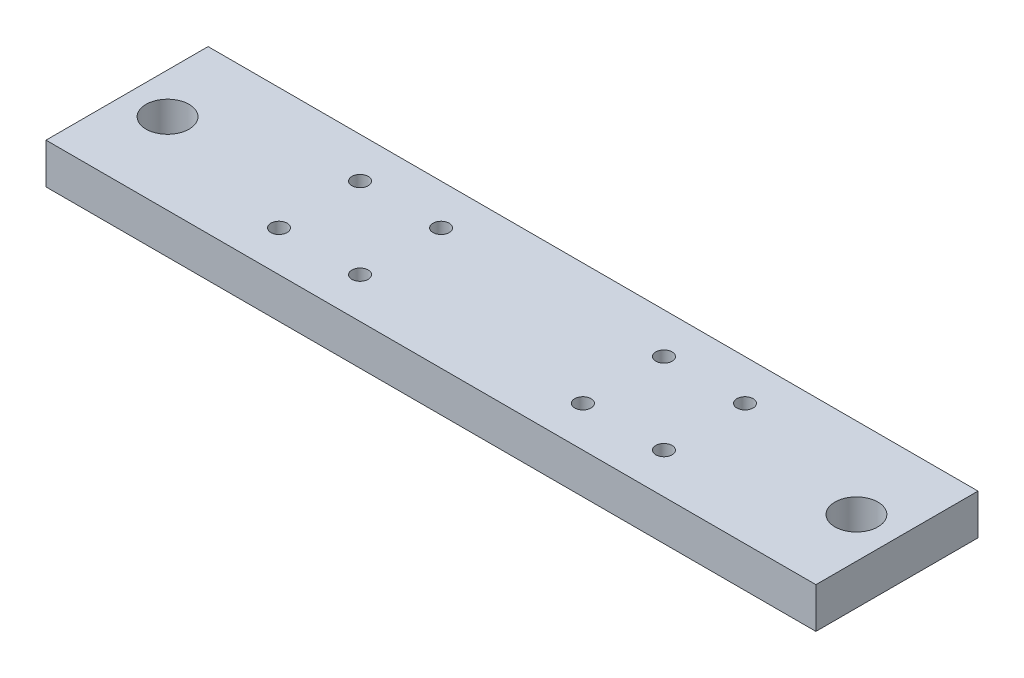
ISO-10303-21;
HEADER;
FILE_DESCRIPTION(('STEP AP214'),'2;1');
FILE_NAME('part.step','',(''),(''),'','','');
FILE_SCHEMA(('AUTOMOTIVE_DESIGN { 1 0 10303 214 1 1 1 1 }'));
ENDSEC;
DATA;
#1=APPLICATION_CONTEXT('core data for automotive mechanical design processes');
#2=APPLICATION_PROTOCOL_DEFINITION('international standard','automotive_design',2000,#1);
#3=PRODUCT_CONTEXT('',#1,'mechanical');
#4=PRODUCT('Part','Part','',(#3));
#5=PRODUCT_RELATED_PRODUCT_CATEGORY('part','',(#4));
#6=PRODUCT_DEFINITION_FORMATION('','',#4);
#7=PRODUCT_DEFINITION_CONTEXT('part definition',#1,'design');
#8=PRODUCT_DEFINITION('design','',#6,#7);
#9=PRODUCT_DEFINITION_SHAPE('','',#8);
#10=(LENGTH_UNIT() NAMED_UNIT(*) SI_UNIT(.MILLI.,.METRE.));
#11=(NAMED_UNIT(*) PLANE_ANGLE_UNIT() SI_UNIT($,.RADIAN.));
#12=(NAMED_UNIT(*) SI_UNIT($,.STERADIAN.) SOLID_ANGLE_UNIT());
#13=UNCERTAINTY_MEASURE_WITH_UNIT(LENGTH_MEASURE(1.E-05),#10,'distance_accuracy_value','');
#14=(GEOMETRIC_REPRESENTATION_CONTEXT(3) GLOBAL_UNCERTAINTY_ASSIGNED_CONTEXT((#13)) GLOBAL_UNIT_ASSIGNED_CONTEXT((#10,
#11,#12)) REPRESENTATION_CONTEXT('',''));
#15=CARTESIAN_POINT('',(0.,0.,0.));
#16=DIRECTION('',(0.,0.,1.));
#17=DIRECTION('',(1.,0.,0.));
#18=AXIS2_PLACEMENT_3D('',#15,#16,#17);
#19=CARTESIAN_POINT('',(120.65,12.7,25.4));
#20=DIRECTION('',(-1.,0.,0.));
#21=DIRECTION('',(0.,0.,1.));
#22=AXIS2_PLACEMENT_3D('',#19,#20,#21);
#23=PLANE('',#22);
#24=DIRECTION('',(0.,0.,-1.));
#25=VECTOR('',#24,1.);
#26=CARTESIAN_POINT('',(120.65,0.,25.4));
#27=LINE('',#26,#25);
#28=CARTESIAN_POINT('',(120.65,0.,25.4));
#29=VERTEX_POINT('',#28);
#30=CARTESIAN_POINT('',(120.65,0.,-25.4));
#31=VERTEX_POINT('',#30);
#32=EDGE_CURVE('E132',#29,#31,#27,.T.);
#33=ORIENTED_EDGE('',*,*,#32,.T.);
#34=DIRECTION('',(0.,-1.,0.));
#35=VECTOR('',#34,1.);
#36=CARTESIAN_POINT('',(120.65,12.7,-25.4));
#37=LINE('',#36,#35);
#38=CARTESIAN_POINT('',(120.65,12.7,-25.4));
#39=VERTEX_POINT('',#38);
#40=EDGE_CURVE('E12',#39,#31,#37,.T.);
#41=ORIENTED_EDGE('',*,*,#40,.F.);
#42=DIRECTION('',(0.,0.,-1.));
#43=VECTOR('',#42,1.);
#44=CARTESIAN_POINT('',(120.65,12.7,25.4));
#45=LINE('',#44,#43);
#46=CARTESIAN_POINT('',(120.65,12.7,25.4));
#47=VERTEX_POINT('',#46);
#48=EDGE_CURVE('E102',#47,#39,#45,.T.);
#49=ORIENTED_EDGE('',*,*,#48,.F.);
#50=DIRECTION('',(0.,-1.,0.));
#51=VECTOR('',#50,1.);
#52=CARTESIAN_POINT('',(120.65,12.7,25.4));
#53=LINE('',#52,#51);
#54=EDGE_CURVE('E115',#47,#29,#53,.T.);
#55=ORIENTED_EDGE('',*,*,#54,.T.);
#56=EDGE_LOOP('',(#33,#41,#49,#55));
#57=FACE_BOUND('',#56,.T.);
#58=ADVANCED_FACE('F50',(#57),#23,.F.);
#59=CARTESIAN_POINT('',(-120.65,12.7,-25.4));
#60=DIRECTION('',(0.,0.,1.));
#61=DIRECTION('',(1.,0.,0.));
#62=AXIS2_PLACEMENT_3D('',#59,#60,#61);
#63=PLANE('',#62);
#64=DIRECTION('',(-1.,0.,0.));
#65=VECTOR('',#64,1.);
#66=CARTESIAN_POINT('',(-120.65,0.,-25.4));
#67=LINE('',#66,#65);
#68=CARTESIAN_POINT('',(-120.65,0.,-25.4));
#69=VERTEX_POINT('',#68);
#70=EDGE_CURVE('E107',#31,#69,#67,.T.);
#71=ORIENTED_EDGE('',*,*,#70,.T.);
#72=DIRECTION('',(0.,-1.,0.));
#73=VECTOR('',#72,1.);
#74=CARTESIAN_POINT('',(-120.65,12.7,-25.4));
#75=LINE('',#74,#73);
#76=CARTESIAN_POINT('',(-120.65,12.7,-25.4));
#77=VERTEX_POINT('',#76);
#78=EDGE_CURVE('E59',#77,#69,#75,.T.);
#79=ORIENTED_EDGE('',*,*,#78,.F.);
#80=DIRECTION('',(-1.,0.,0.));
#81=VECTOR('',#80,1.);
#82=CARTESIAN_POINT('',(-120.65,12.7,-25.4));
#83=LINE('',#82,#81);
#84=EDGE_CURVE('E97',#39,#77,#83,.T.);
#85=ORIENTED_EDGE('',*,*,#84,.F.);
#86=ORIENTED_EDGE('',*,*,#40,.T.);
#87=EDGE_LOOP('',(#71,#79,#85,#86));
#88=FACE_BOUND('',#87,.T.);
#89=ADVANCED_FACE('F106',(#88),#63,.F.);
#90=CARTESIAN_POINT('',(-120.65,12.7,25.4));
#91=DIRECTION('',(1.,0.,0.));
#92=DIRECTION('',(0.,0.,-1.));
#93=AXIS2_PLACEMENT_3D('',#90,#91,#92);
#94=PLANE('',#93);
#95=DIRECTION('',(0.,0.,1.));
#96=VECTOR('',#95,1.);
#97=CARTESIAN_POINT('',(-120.65,0.,25.4));
#98=LINE('',#97,#96);
#99=CARTESIAN_POINT('',(-120.65,0.,25.4));
#100=VERTEX_POINT('',#99);
#101=EDGE_CURVE('E84',#69,#100,#98,.T.);
#102=ORIENTED_EDGE('',*,*,#101,.T.);
#103=DIRECTION('',(0.,-1.,0.));
#104=VECTOR('',#103,1.);
#105=CARTESIAN_POINT('',(-120.65,12.7,25.4));
#106=LINE('',#105,#104);
#107=CARTESIAN_POINT('',(-120.65,12.7,25.4));
#108=VERTEX_POINT('',#107);
#109=EDGE_CURVE('E109',#108,#100,#106,.T.);
#110=ORIENTED_EDGE('',*,*,#109,.F.);
#111=DIRECTION('',(0.,0.,1.));
#112=VECTOR('',#111,1.);
#113=CARTESIAN_POINT('',(-120.65,12.7,25.4));
#114=LINE('',#113,#112);
#115=EDGE_CURVE('E100',#77,#108,#114,.T.);
#116=ORIENTED_EDGE('',*,*,#115,.F.);
#117=ORIENTED_EDGE('',*,*,#78,.T.);
#118=EDGE_LOOP('',(#102,#110,#116,#117));
#119=FACE_BOUND('',#118,.T.);
#120=ADVANCED_FACE('F110',(#119),#94,.F.);
#121=CARTESIAN_POINT('',(-120.65,12.7,25.4));
#122=DIRECTION('',(0.,0.,-1.));
#123=DIRECTION('',(-1.,0.,0.));
#124=AXIS2_PLACEMENT_3D('',#121,#122,#123);
#125=PLANE('',#124);
#126=DIRECTION('',(1.,0.,0.));
#127=VECTOR('',#126,1.);
#128=CARTESIAN_POINT('',(-120.65,0.,25.4));
#129=LINE('',#128,#127);
#130=EDGE_CURVE('E90',#100,#29,#129,.T.);
#131=ORIENTED_EDGE('',*,*,#130,.T.);
#132=ORIENTED_EDGE('',*,*,#54,.F.);
#133=DIRECTION('',(1.,0.,0.));
#134=VECTOR('',#133,1.);
#135=CARTESIAN_POINT('',(-120.65,12.7,25.4));
#136=LINE('',#135,#134);
#137=EDGE_CURVE('E67',#108,#47,#136,.T.);
#138=ORIENTED_EDGE('',*,*,#137,.F.);
#139=ORIENTED_EDGE('',*,*,#109,.T.);
#140=EDGE_LOOP('',(#131,#132,#138,#139));
#141=FACE_BOUND('',#140,.T.);
#142=ADVANCED_FACE('F228',(#141),#125,.F.);
#143=CARTESIAN_POINT('',(0.,12.7,0.));
#144=DIRECTION('',(0.,-1.,0.));
#145=DIRECTION('',(0.,0.,-1.));
#146=AXIS2_PLACEMENT_3D('',#143,#144,#145);
#147=PLANE('',#146);
#148=CARTESIAN_POINT('',(-107.95,12.7,0.));
#149=DIRECTION('',(0.,1.,0.));
#150=DIRECTION('',(0.,0.,1.));
#151=AXIS2_PLACEMENT_3D('',#148,#149,#150);
#152=CIRCLE('',#151,6.74623999999982);
#153=CARTESIAN_POINT('',(-107.95,12.7,6.74623999999983));
#154=VERTEX_POINT('',#153);
#155=EDGE_CURVE('E216',#154,#154,#152,.T.);
#156=ORIENTED_EDGE('',*,*,#155,.F.);
#157=EDGE_LOOP('',(#156));
#158=FACE_BOUND('',#157,.T.);
#159=CARTESIAN_POINT('',(107.95,12.7,0.));
#160=DIRECTION('',(0.,1.,0.));
#161=DIRECTION('',(0.,0.,1.));
#162=AXIS2_PLACEMENT_3D('',#159,#160,#161);
#163=CIRCLE('',#162,6.74623999999982);
#164=CARTESIAN_POINT('',(107.95,12.7,6.74623999999979));
#165=VERTEX_POINT('',#164);
#166=EDGE_CURVE('E208',#165,#165,#163,.T.);
#167=ORIENTED_EDGE('',*,*,#166,.F.);
#168=EDGE_LOOP('',(#167));
#169=FACE_BOUND('',#168,.T.);
#170=CARTESIAN_POINT('',(-60.325,12.7,-12.7));
#171=DIRECTION('',(0.,1.,0.));
#172=DIRECTION('',(0.,0.,1.));
#173=AXIS2_PLACEMENT_3D('',#170,#171,#172);
#174=CIRCLE('',#173,2.55269999999983);
#175=CARTESIAN_POINT('',(-60.325,12.7,-10.1473000000002));
#176=VERTEX_POINT('',#175);
#177=EDGE_CURVE('E198',#176,#176,#174,.T.);
#178=ORIENTED_EDGE('',*,*,#177,.F.);
#179=EDGE_LOOP('',(#178));
#180=FACE_BOUND('',#179,.T.);
#181=CARTESIAN_POINT('',(-34.925,12.7,-12.7));
#182=DIRECTION('',(0.,1.,0.));
#183=DIRECTION('',(0.,0.,1.));
#184=AXIS2_PLACEMENT_3D('',#181,#182,#183);
#185=CIRCLE('',#184,2.55269999999982);
#186=CARTESIAN_POINT('',(-34.925,12.7,-10.1473000000002));
#187=VERTEX_POINT('',#186);
#188=EDGE_CURVE('E189',#187,#187,#185,.T.);
#189=ORIENTED_EDGE('',*,*,#188,.F.);
#190=EDGE_LOOP('',(#189));
#191=FACE_BOUND('',#190,.T.);
#192=CARTESIAN_POINT('',(-34.925,12.7,12.7));
#193=DIRECTION('',(0.,1.,0.));
#194=DIRECTION('',(0.,0.,1.));
#195=AXIS2_PLACEMENT_3D('',#192,#193,#194);
#196=CIRCLE('',#195,2.55269999999982);
#197=CARTESIAN_POINT('',(-34.925,12.7,15.2526999999998));
#198=VERTEX_POINT('',#197);
#199=EDGE_CURVE('E181',#198,#198,#196,.T.);
#200=ORIENTED_EDGE('',*,*,#199,.F.);
#201=EDGE_LOOP('',(#200));
#202=FACE_BOUND('',#201,.T.);
#203=CARTESIAN_POINT('',(-60.325,12.7,12.7));
#204=DIRECTION('',(0.,1.,0.));
#205=DIRECTION('',(0.,0.,1.));
#206=AXIS2_PLACEMENT_3D('',#203,#204,#205);
#207=CIRCLE('',#206,2.55269999999983);
#208=CARTESIAN_POINT('',(-60.325,12.7,15.2526999999998));
#209=VERTEX_POINT('',#208);
#210=EDGE_CURVE('E170',#209,#209,#207,.T.);
#211=ORIENTED_EDGE('',*,*,#210,.F.);
#212=EDGE_LOOP('',(#211));
#213=FACE_BOUND('',#212,.T.);
#214=CARTESIAN_POINT('',(34.925,12.7,12.7));
#215=DIRECTION('',(0.,1.,0.));
#216=DIRECTION('',(0.,0.,1.));
#217=AXIS2_PLACEMENT_3D('',#214,#215,#216);
#218=CIRCLE('',#217,2.55269999999982);
#219=CARTESIAN_POINT('',(34.925,12.7,15.2526999999998));
#220=VERTEX_POINT('',#219);
#221=EDGE_CURVE('E161',#220,#220,#218,.T.);
#222=ORIENTED_EDGE('',*,*,#221,.F.);
#223=EDGE_LOOP('',(#222));
#224=FACE_BOUND('',#223,.T.);
#225=CARTESIAN_POINT('',(34.925,12.7,-12.7));
#226=DIRECTION('',(0.,1.,0.));
#227=DIRECTION('',(0.,0.,1.));
#228=AXIS2_PLACEMENT_3D('',#225,#226,#227);
#229=CIRCLE('',#228,2.55269999999983);
#230=CARTESIAN_POINT('',(34.925,12.7,-10.1473000000002));
#231=VERTEX_POINT('',#230);
#232=EDGE_CURVE('E153',#231,#231,#229,.T.);
#233=ORIENTED_EDGE('',*,*,#232,.F.);
#234=EDGE_LOOP('',(#233));
#235=FACE_BOUND('',#234,.T.);
#236=CARTESIAN_POINT('',(60.325,12.7,-12.7));
#237=DIRECTION('',(0.,1.,0.));
#238=DIRECTION('',(0.,0.,1.));
#239=AXIS2_PLACEMENT_3D('',#236,#237,#238);
#240=CIRCLE('',#239,2.55269999999982);
#241=CARTESIAN_POINT('',(60.325,12.7,-10.1473000000002));
#242=VERTEX_POINT('',#241);
#243=EDGE_CURVE('E142',#242,#242,#240,.T.);
#244=ORIENTED_EDGE('',*,*,#243,.F.);
#245=EDGE_LOOP('',(#244));
#246=FACE_BOUND('',#245,.T.);
#247=CARTESIAN_POINT('',(60.325,12.7,12.7));
#248=DIRECTION('',(0.,1.,0.));
#249=DIRECTION('',(0.,0.,1.));
#250=AXIS2_PLACEMENT_3D('',#247,#248,#249);
#251=CIRCLE('',#250,2.55269999999982);
#252=CARTESIAN_POINT('',(60.325,12.7,15.2526999999998));
#253=VERTEX_POINT('',#252);
#254=EDGE_CURVE('E133',#253,#253,#251,.T.);
#255=ORIENTED_EDGE('',*,*,#254,.F.);
#256=EDGE_LOOP('',(#255));
#257=FACE_BOUND('',#256,.T.);
#258=ORIENTED_EDGE('',*,*,#48,.T.);
#259=ORIENTED_EDGE('',*,*,#84,.T.);
#260=ORIENTED_EDGE('',*,*,#115,.T.);
#261=ORIENTED_EDGE('',*,*,#137,.T.);
#262=EDGE_LOOP('',(#258,#259,#260,#261));
#263=FACE_BOUND('',#262,.T.);
#264=ADVANCED_FACE('F98',(#158,#169,#180,#191,#202,#213,#224,#235,#246,#257,#263),#147,.F.);
#265=CARTESIAN_POINT('',(0.,0.,0.));
#266=DIRECTION('',(0.,-1.,0.));
#267=DIRECTION('',(0.,0.,-1.));
#268=AXIS2_PLACEMENT_3D('',#265,#266,#267);
#269=PLANE('',#268);
#270=CARTESIAN_POINT('',(-107.95,0.,0.));
#271=DIRECTION('',(0.,1.,0.));
#272=DIRECTION('',(0.,0.,1.));
#273=AXIS2_PLACEMENT_3D('',#270,#271,#272);
#274=CIRCLE('',#273,6.74623999999982);
#275=CARTESIAN_POINT('',(-107.95,0.,6.74623999999983));
#276=VERTEX_POINT('',#275);
#277=EDGE_CURVE('E213',#276,#276,#274,.T.);
#278=ORIENTED_EDGE('',*,*,#277,.T.);
#279=EDGE_LOOP('',(#278));
#280=FACE_BOUND('',#279,.T.);
#281=CARTESIAN_POINT('',(107.95,0.,0.));
#282=DIRECTION('',(0.,1.,0.));
#283=DIRECTION('',(0.,0.,1.));
#284=AXIS2_PLACEMENT_3D('',#281,#282,#283);
#285=CIRCLE('',#284,6.74623999999982);
#286=CARTESIAN_POINT('',(107.95,0.,6.74623999999979));
#287=VERTEX_POINT('',#286);
#288=EDGE_CURVE('E203',#287,#287,#285,.T.);
#289=ORIENTED_EDGE('',*,*,#288,.T.);
#290=EDGE_LOOP('',(#289));
#291=FACE_BOUND('',#290,.T.);
#292=CARTESIAN_POINT('',(-60.325,0.,-12.7));
#293=DIRECTION('',(0.,1.,0.));
#294=DIRECTION('',(0.,0.,1.));
#295=AXIS2_PLACEMENT_3D('',#292,#293,#294);
#296=CIRCLE('',#295,2.55269999999982);
#297=CARTESIAN_POINT('',(-60.325,0.,-10.1473000000002));
#298=VERTEX_POINT('',#297);
#299=EDGE_CURVE('E194',#298,#298,#296,.T.);
#300=ORIENTED_EDGE('',*,*,#299,.T.);
#301=EDGE_LOOP('',(#300));
#302=FACE_BOUND('',#301,.T.);
#303=CARTESIAN_POINT('',(-34.925,0.,-12.7));
#304=DIRECTION('',(0.,1.,0.));
#305=DIRECTION('',(0.,0.,1.));
#306=AXIS2_PLACEMENT_3D('',#303,#304,#305);
#307=CIRCLE('',#306,2.55269999999982);
#308=CARTESIAN_POINT('',(-34.925,0.,-10.1473000000002));
#309=VERTEX_POINT('',#308);
#310=EDGE_CURVE('E186',#309,#309,#307,.T.);
#311=ORIENTED_EDGE('',*,*,#310,.T.);
#312=EDGE_LOOP('',(#311));
#313=FACE_BOUND('',#312,.T.);
#314=CARTESIAN_POINT('',(-34.925,0.,12.7));
#315=DIRECTION('',(0.,1.,0.));
#316=DIRECTION('',(0.,0.,1.));
#317=AXIS2_PLACEMENT_3D('',#314,#315,#316);
#318=CIRCLE('',#317,2.55269999999982);
#319=CARTESIAN_POINT('',(-34.925,0.,15.2526999999998));
#320=VERTEX_POINT('',#319);
#321=EDGE_CURVE('E175',#320,#320,#318,.T.);
#322=ORIENTED_EDGE('',*,*,#321,.T.);
#323=EDGE_LOOP('',(#322));
#324=FACE_BOUND('',#323,.T.);
#325=CARTESIAN_POINT('',(-60.325,0.,12.7));
#326=DIRECTION('',(0.,1.,0.));
#327=DIRECTION('',(0.,0.,1.));
#328=AXIS2_PLACEMENT_3D('',#325,#326,#327);
#329=CIRCLE('',#328,2.55269999999982);
#330=CARTESIAN_POINT('',(-60.325,0.,15.2526999999998));
#331=VERTEX_POINT('',#330);
#332=EDGE_CURVE('E166',#331,#331,#329,.T.);
#333=ORIENTED_EDGE('',*,*,#332,.T.);
#334=EDGE_LOOP('',(#333));
#335=FACE_BOUND('',#334,.T.);
#336=CARTESIAN_POINT('',(34.925,0.,12.7));
#337=DIRECTION('',(0.,1.,0.));
#338=DIRECTION('',(0.,0.,1.));
#339=AXIS2_PLACEMENT_3D('',#336,#337,#338);
#340=CIRCLE('',#339,2.55269999999982);
#341=CARTESIAN_POINT('',(34.925,0.,15.2526999999998));
#342=VERTEX_POINT('',#341);
#343=EDGE_CURVE('E158',#342,#342,#340,.T.);
#344=ORIENTED_EDGE('',*,*,#343,.T.);
#345=EDGE_LOOP('',(#344));
#346=FACE_BOUND('',#345,.T.);
#347=CARTESIAN_POINT('',(34.925,0.,-12.7));
#348=DIRECTION('',(0.,1.,0.));
#349=DIRECTION('',(0.,0.,1.));
#350=AXIS2_PLACEMENT_3D('',#347,#348,#349);
#351=CIRCLE('',#350,2.55269999999982);
#352=CARTESIAN_POINT('',(34.925,0.,-10.1473000000002));
#353=VERTEX_POINT('',#352);
#354=EDGE_CURVE('E147',#353,#353,#351,.T.);
#355=ORIENTED_EDGE('',*,*,#354,.T.);
#356=EDGE_LOOP('',(#355));
#357=FACE_BOUND('',#356,.T.);
#358=CARTESIAN_POINT('',(60.325,0.,-12.7));
#359=DIRECTION('',(0.,1.,0.));
#360=DIRECTION('',(0.,0.,1.));
#361=AXIS2_PLACEMENT_3D('',#358,#359,#360);
#362=CIRCLE('',#361,2.55269999999982);
#363=CARTESIAN_POINT('',(60.325,0.,-10.1473000000002));
#364=VERTEX_POINT('',#363);
#365=EDGE_CURVE('E138',#364,#364,#362,.T.);
#366=ORIENTED_EDGE('',*,*,#365,.T.);
#367=EDGE_LOOP('',(#366));
#368=FACE_BOUND('',#367,.T.);
#369=CARTESIAN_POINT('',(60.325,0.,12.7));
#370=DIRECTION('',(0.,1.,0.));
#371=DIRECTION('',(0.,0.,1.));
#372=AXIS2_PLACEMENT_3D('',#369,#370,#371);
#373=CIRCLE('',#372,2.55269999999982);
#374=CARTESIAN_POINT('',(60.325,0.,15.2526999999998));
#375=VERTEX_POINT('',#374);
#376=EDGE_CURVE('E129',#375,#375,#373,.T.);
#377=ORIENTED_EDGE('',*,*,#376,.T.);
#378=EDGE_LOOP('',(#377));
#379=FACE_BOUND('',#378,.T.);
#380=ORIENTED_EDGE('',*,*,#32,.F.);
#381=ORIENTED_EDGE('',*,*,#130,.F.);
#382=ORIENTED_EDGE('',*,*,#101,.F.);
#383=ORIENTED_EDGE('',*,*,#70,.F.);
#384=EDGE_LOOP('',(#380,#381,#382,#383));
#385=FACE_BOUND('',#384,.T.);
#386=ADVANCED_FACE('F227',(#280,#291,#302,#313,#324,#335,#346,#357,#368,#379,#385),#269,.T.);
#387=CARTESIAN_POINT('',(60.325,12.7,12.7));
#388=DIRECTION('',(0.,1.,0.));
#389=DIRECTION('',(0.,0.,1.));
#390=AXIS2_PLACEMENT_3D('',#387,#388,#389);
#391=CYLINDRICAL_SURFACE('',#390,2.55269999999982);
#392=ORIENTED_EDGE('',*,*,#376,.F.);
#393=EDGE_LOOP('',(#392));
#394=FACE_BOUND('',#393,.T.);
#395=ORIENTED_EDGE('',*,*,#254,.T.);
#396=EDGE_LOOP('',(#395));
#397=FACE_BOUND('',#396,.T.);
#398=ADVANCED_FACE('F248',(#394,#397),#391,.F.);
#399=CARTESIAN_POINT('',(60.325,12.7,-12.7));
#400=DIRECTION('',(0.,1.,0.));
#401=DIRECTION('',(0.,0.,1.));
#402=AXIS2_PLACEMENT_3D('',#399,#400,#401);
#403=CYLINDRICAL_SURFACE('',#402,2.55269999999982);
#404=ORIENTED_EDGE('',*,*,#365,.F.);
#405=EDGE_LOOP('',(#404));
#406=FACE_BOUND('',#405,.T.);
#407=ORIENTED_EDGE('',*,*,#243,.T.);
#408=EDGE_LOOP('',(#407));
#409=FACE_BOUND('',#408,.T.);
#410=ADVANCED_FACE('F250',(#406,#409),#403,.F.);
#411=CARTESIAN_POINT('',(34.925,12.7,-12.7));
#412=DIRECTION('',(0.,1.,0.));
#413=DIRECTION('',(0.,0.,1.));
#414=AXIS2_PLACEMENT_3D('',#411,#412,#413);
#415=CYLINDRICAL_SURFACE('',#414,2.55269999999983);
#416=ORIENTED_EDGE('',*,*,#354,.F.);
#417=EDGE_LOOP('',(#416));
#418=FACE_BOUND('',#417,.T.);
#419=ORIENTED_EDGE('',*,*,#232,.T.);
#420=EDGE_LOOP('',(#419));
#421=FACE_BOUND('',#420,.T.);
#422=ADVANCED_FACE('F257',(#418,#421),#415,.F.);
#423=CARTESIAN_POINT('',(34.925,12.7,12.7));
#424=DIRECTION('',(0.,1.,0.));
#425=DIRECTION('',(0.,0.,1.));
#426=AXIS2_PLACEMENT_3D('',#423,#424,#425);
#427=CYLINDRICAL_SURFACE('',#426,2.55269999999982);
#428=ORIENTED_EDGE('',*,*,#343,.F.);
#429=EDGE_LOOP('',(#428));
#430=FACE_BOUND('',#429,.T.);
#431=ORIENTED_EDGE('',*,*,#221,.T.);
#432=EDGE_LOOP('',(#431));
#433=FACE_BOUND('',#432,.T.);
#434=ADVANCED_FACE('F339',(#430,#433),#427,.F.);
#435=CARTESIAN_POINT('',(-60.325,12.7,12.7));
#436=DIRECTION('',(0.,1.,0.));
#437=DIRECTION('',(0.,0.,1.));
#438=AXIS2_PLACEMENT_3D('',#435,#436,#437);
#439=CYLINDRICAL_SURFACE('',#438,2.55269999999983);
#440=ORIENTED_EDGE('',*,*,#332,.F.);
#441=EDGE_LOOP('',(#440));
#442=FACE_BOUND('',#441,.T.);
#443=ORIENTED_EDGE('',*,*,#210,.T.);
#444=EDGE_LOOP('',(#443));
#445=FACE_BOUND('',#444,.T.);
#446=ADVANCED_FACE('F349',(#442,#445),#439,.F.);
#447=CARTESIAN_POINT('',(-34.925,12.7,12.7));
#448=DIRECTION('',(0.,1.,0.));
#449=DIRECTION('',(0.,0.,1.));
#450=AXIS2_PLACEMENT_3D('',#447,#448,#449);
#451=CYLINDRICAL_SURFACE('',#450,2.55269999999982);
#452=ORIENTED_EDGE('',*,*,#321,.F.);
#453=EDGE_LOOP('',(#452));
#454=FACE_BOUND('',#453,.T.);
#455=ORIENTED_EDGE('',*,*,#199,.T.);
#456=EDGE_LOOP('',(#455));
#457=FACE_BOUND('',#456,.T.);
#458=ADVANCED_FACE('F359',(#454,#457),#451,.F.);
#459=CARTESIAN_POINT('',(-34.925,12.7,-12.7));
#460=DIRECTION('',(0.,1.,0.));
#461=DIRECTION('',(0.,0.,1.));
#462=AXIS2_PLACEMENT_3D('',#459,#460,#461);
#463=CYLINDRICAL_SURFACE('',#462,2.55269999999982);
#464=ORIENTED_EDGE('',*,*,#310,.F.);
#465=EDGE_LOOP('',(#464));
#466=FACE_BOUND('',#465,.T.);
#467=ORIENTED_EDGE('',*,*,#188,.T.);
#468=EDGE_LOOP('',(#467));
#469=FACE_BOUND('',#468,.T.);
#470=ADVANCED_FACE('F369',(#466,#469),#463,.F.);
#471=CARTESIAN_POINT('',(-60.325,12.7,-12.7));
#472=DIRECTION('',(0.,1.,0.));
#473=DIRECTION('',(0.,0.,1.));
#474=AXIS2_PLACEMENT_3D('',#471,#472,#473);
#475=CYLINDRICAL_SURFACE('',#474,2.55269999999983);
#476=ORIENTED_EDGE('',*,*,#299,.F.);
#477=EDGE_LOOP('',(#476));
#478=FACE_BOUND('',#477,.T.);
#479=ORIENTED_EDGE('',*,*,#177,.T.);
#480=EDGE_LOOP('',(#479));
#481=FACE_BOUND('',#480,.T.);
#482=ADVANCED_FACE('F379',(#478,#481),#475,.F.);
#483=CARTESIAN_POINT('',(107.95,12.7,0.));
#484=DIRECTION('',(0.,1.,0.));
#485=DIRECTION('',(0.,0.,1.));
#486=AXIS2_PLACEMENT_3D('',#483,#484,#485);
#487=CYLINDRICAL_SURFACE('',#486,6.74623999999982);
#488=ORIENTED_EDGE('',*,*,#288,.F.);
#489=EDGE_LOOP('',(#488));
#490=FACE_BOUND('',#489,.T.);
#491=ORIENTED_EDGE('',*,*,#166,.T.);
#492=EDGE_LOOP('',(#491));
#493=FACE_BOUND('',#492,.T.);
#494=ADVANCED_FACE('F389',(#490,#493),#487,.F.);
#495=CARTESIAN_POINT('',(-107.95,12.7,0.));
#496=DIRECTION('',(0.,1.,0.));
#497=DIRECTION('',(0.,0.,1.));
#498=AXIS2_PLACEMENT_3D('',#495,#496,#497);
#499=CYLINDRICAL_SURFACE('',#498,6.74623999999982);
#500=ORIENTED_EDGE('',*,*,#277,.F.);
#501=EDGE_LOOP('',(#500));
#502=FACE_BOUND('',#501,.T.);
#503=ORIENTED_EDGE('',*,*,#155,.T.);
#504=EDGE_LOOP('',(#503));
#505=FACE_BOUND('',#504,.T.);
#506=ADVANCED_FACE('F223',(#502,#505),#499,.F.);
#507=CLOSED_SHELL('',(#58,#89,#120,#142,#264,#386,#398,#410,#422,#434,#446,#458,#470,#482,#494,#506));
#508=MANIFOLD_SOLID_BREP('B2',#507);
#509=ADVANCED_BREP_SHAPE_REPRESENTATION('',(#18,#508),#14);
#510=SHAPE_DEFINITION_REPRESENTATION(#9,#509);
ENDSEC;
END-ISO-10303-21;
